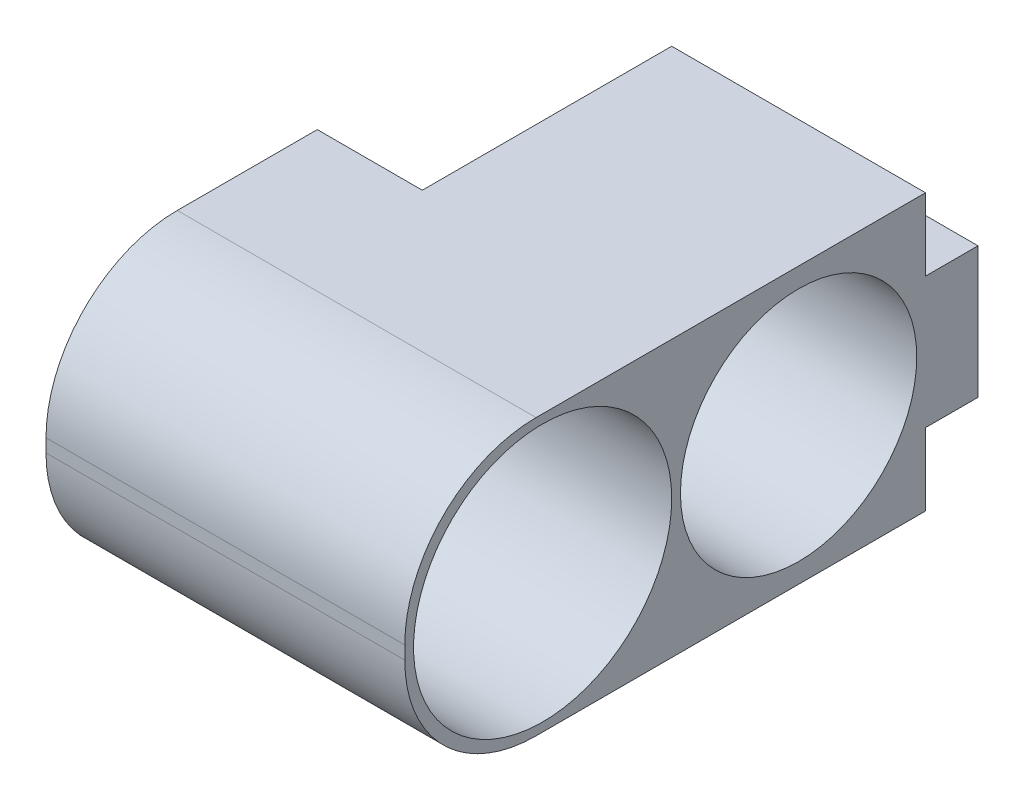
ISO-10303-21;
HEADER;
FILE_DESCRIPTION(('STEP AP214'),'2;1');
FILE_NAME('part.step','',(''),(''),'','','');
FILE_SCHEMA(('AUTOMOTIVE_DESIGN { 1 0 10303 214 1 1 1 1 }'));
ENDSEC;
DATA;
#1=APPLICATION_CONTEXT('core data for automotive mechanical design processes');
#2=APPLICATION_PROTOCOL_DEFINITION('international standard','automotive_design',2000,#1);
#3=PRODUCT_CONTEXT('',#1,'mechanical');
#4=PRODUCT('Part','Part','',(#3));
#5=PRODUCT_RELATED_PRODUCT_CATEGORY('part','',(#4));
#6=PRODUCT_DEFINITION_FORMATION('','',#4);
#7=PRODUCT_DEFINITION_CONTEXT('part definition',#1,'design');
#8=PRODUCT_DEFINITION('design','',#6,#7);
#9=PRODUCT_DEFINITION_SHAPE('','',#8);
#10=(LENGTH_UNIT() NAMED_UNIT(*) SI_UNIT(.MILLI.,.METRE.));
#11=(NAMED_UNIT(*) PLANE_ANGLE_UNIT() SI_UNIT($,.RADIAN.));
#12=(NAMED_UNIT(*) SI_UNIT($,.STERADIAN.) SOLID_ANGLE_UNIT());
#13=UNCERTAINTY_MEASURE_WITH_UNIT(LENGTH_MEASURE(1.E-05),#10,'distance_accuracy_value','');
#14=(GEOMETRIC_REPRESENTATION_CONTEXT(3) GLOBAL_UNCERTAINTY_ASSIGNED_CONTEXT((#13)) GLOBAL_UNIT_ASSIGNED_CONTEXT((#10,
#11,#12)) REPRESENTATION_CONTEXT('',''));
#15=CARTESIAN_POINT('',(0.,0.,0.));
#16=DIRECTION('',(0.,0.,1.));
#17=DIRECTION('',(1.,0.,0.));
#18=AXIS2_PLACEMENT_3D('',#15,#16,#17);
#19=CARTESIAN_POINT('',(-3.00000000000002,0.,8.88178419700125E-13));
#20=DIRECTION('',(1.,0.,0.));
#21=DIRECTION('',(0.,0.,-1.));
#22=AXIS2_PLACEMENT_3D('',#19,#20,#21);
#23=PLANE('',#22);
#24=DIRECTION('',(0.,-0.999999999999999,0.));
#25=VECTOR('',#24,1.);
#26=CARTESIAN_POINT('',(-2.99999999999999,3.15000000000002,0.));
#27=LINE('',#26,#25);
#28=CARTESIAN_POINT('',(-3.00000000000003,1.50000000000004,1.33226762955019E-12));
#29=VERTEX_POINT('',#28);
#30=CARTESIAN_POINT('',(-3.00000000000002,-1.49999999999999,8.88178419700125E-13));
#31=VERTEX_POINT('',#30);
#32=EDGE_CURVE('E175',#29,#31,#27,.T.);
#33=ORIENTED_EDGE('',*,*,#32,.F.);
#34=DIRECTION('',(0.,0.,-1.));
#35=VECTOR('',#34,1.);
#36=CARTESIAN_POINT('',(-3.00000000000003,1.50000000000004,1.33226762955019E-12));
#37=LINE('',#36,#35);
#38=CARTESIAN_POINT('',(-3.00000000000002,1.50000000000004,-1.19999999999987));
#39=VERTEX_POINT('',#38);
#40=EDGE_CURVE('E191',#29,#39,#37,.T.);
#41=ORIENTED_EDGE('',*,*,#40,.T.);
#42=DIRECTION('',(0.,0.999999999999999,0.));
#43=VECTOR('',#42,1.);
#44=CARTESIAN_POINT('',(-3.00000000000002,-1.49999999999995,-1.19999999999987));
#45=LINE('',#44,#43);
#46=CARTESIAN_POINT('',(-3.00000000000002,-1.49999999999995,-1.19999999999987));
#47=VERTEX_POINT('',#46);
#48=EDGE_CURVE('E197',#47,#39,#45,.T.);
#49=ORIENTED_EDGE('',*,*,#48,.F.);
#50=DIRECTION('',(0.,0.,-1.));
#51=VECTOR('',#50,1.);
#52=CARTESIAN_POINT('',(-3.00000000000002,-1.49999999999999,8.88178419700125E-13));
#53=LINE('',#52,#51);
#54=EDGE_CURVE('E198',#31,#47,#53,.T.);
#55=ORIENTED_EDGE('',*,*,#54,.F.);
#56=EDGE_LOOP('',(#33,#41,#49,#55));
#57=FACE_BOUND('',#56,.T.);
#58=ADVANCED_FACE('F43',(#57),#23,.F.);
#59=CARTESIAN_POINT('',(-3.00000000000002,-3.14999999999999,11.9000000000011));
#60=DIRECTION('',(0.,0.,-1.));
#61=DIRECTION('',(0.,0.999999999999999,0.));
#62=AXIS2_PLACEMENT_3D('',#59,#60,#61);
#63=PLANE('',#62);
#64=DIRECTION('',(0.,0.999999999999999,0.));
#65=VECTOR('',#64,1.);
#66=CARTESIAN_POINT('',(0.,-3.14999999999999,11.9));
#67=LINE('',#66,#65);
#68=CARTESIAN_POINT('',(0.,-0.14999999999997,11.9000000000005));
#69=VERTEX_POINT('',#68);
#70=CARTESIAN_POINT('',(0.,0.150000000000025,11.9000000000009));
#71=VERTEX_POINT('',#70);
#72=EDGE_CURVE('E184',#69,#71,#67,.T.);
#73=ORIENTED_EDGE('',*,*,#72,.T.);
#74=DIRECTION('',(1.,0.,0.));
#75=VECTOR('',#74,1.);
#76=CARTESIAN_POINT('',(-3.00000000000001,0.150000000000018,11.9000000000005));
#77=LINE('',#76,#75);
#78=CARTESIAN_POINT('',(-8.20000000000001,0.150000000000018,11.9000000000009));
#79=VERTEX_POINT('',#78);
#80=EDGE_CURVE('E61',#71,#79,#77,.F.);
#81=ORIENTED_EDGE('',*,*,#80,.T.);
#82=DIRECTION('',(0.,0.999999999999999,0.));
#83=VECTOR('',#82,1.);
#84=CARTESIAN_POINT('',(-8.20000000000001,3.15000000000005,11.8999999999996));
#85=LINE('',#84,#83);
#86=CARTESIAN_POINT('',(-8.20000000000002,-0.149999999999977,11.9));
#87=VERTEX_POINT('',#86);
#88=EDGE_CURVE('E160',#87,#79,#85,.T.);
#89=ORIENTED_EDGE('',*,*,#88,.F.);
#90=DIRECTION('',(1.,0.,0.));
#91=VECTOR('',#90,1.);
#92=CARTESIAN_POINT('',(0.,-0.14999999999997,11.9000000000005));
#93=LINE('',#92,#91);
#94=EDGE_CURVE('E224',#87,#69,#93,.T.);
#95=ORIENTED_EDGE('',*,*,#94,.T.);
#96=EDGE_LOOP('',(#73,#81,#89,#95));
#97=FACE_BOUND('',#96,.T.);
#98=ADVANCED_FACE('F233',(#97),#63,.F.);
#99=CARTESIAN_POINT('',(-3.00000000000003,3.15000000000001,11.9000000000009));
#100=DIRECTION('',(0.,-0.999999999999999,0.));
#101=DIRECTION('',(0.,0.,-1.));
#102=AXIS2_PLACEMENT_3D('',#99,#100,#101);
#103=PLANE('',#102);
#104=DIRECTION('',(0.,0.,-1.));
#105=VECTOR('',#104,1.);
#106=CARTESIAN_POINT('',(-8.20000000000001,3.15000000000005,11.8999999999996));
#107=LINE('',#106,#105);
#108=CARTESIAN_POINT('',(-8.20000000000002,3.15000000000003,8.90000000000013));
#109=VERTEX_POINT('',#108);
#110=CARTESIAN_POINT('',(-8.20000000000002,3.15000000000002,5.70000000000004));
#111=VERTEX_POINT('',#110);
#112=EDGE_CURVE('E134',#109,#111,#107,.T.);
#113=ORIENTED_EDGE('',*,*,#112,.F.);
#114=DIRECTION('',(1.,0.,0.));
#115=VECTOR('',#114,1.);
#116=CARTESIAN_POINT('',(-3.00000000000001,3.15000000000001,8.89999999999969));
#117=LINE('',#116,#115);
#118=CARTESIAN_POINT('',(0.,3.15000000000002,8.90000000000102));
#119=VERTEX_POINT('',#118);
#120=EDGE_CURVE('E172',#109,#119,#117,.T.);
#121=ORIENTED_EDGE('',*,*,#120,.T.);
#122=DIRECTION('',(0.,0.,-1.));
#123=VECTOR('',#122,1.);
#124=CARTESIAN_POINT('',(0.,3.15000000000004,11.9000000000005));
#125=LINE('',#124,#123);
#126=CARTESIAN_POINT('',(0.,3.15000000000003,-4.44089209850063E-13));
#127=VERTEX_POINT('',#126);
#128=EDGE_CURVE('E182',#119,#127,#125,.T.);
#129=ORIENTED_EDGE('',*,*,#128,.T.);
#130=DIRECTION('',(1.,0.,0.));
#131=VECTOR('',#130,1.);
#132=CARTESIAN_POINT('',(-2.99999999999999,3.15000000000002,0.));
#133=LINE('',#132,#131);
#134=CARTESIAN_POINT('',(-5.80000000000001,3.15000000000003,4.44089209850063E-13));
#135=VERTEX_POINT('',#134);
#136=EDGE_CURVE('E189',#135,#127,#133,.T.);
#137=ORIENTED_EDGE('',*,*,#136,.F.);
#138=DIRECTION('',(0.,0.,-1.));
#139=VECTOR('',#138,1.);
#140=CARTESIAN_POINT('',(-5.80000000000001,3.15000000000003,4.44089209850063E-13));
#141=LINE('',#140,#139);
#142=CARTESIAN_POINT('',(-5.80000000000002,3.15000000000001,5.70000000000004));
#143=VERTEX_POINT('',#142);
#144=EDGE_CURVE('E156',#143,#135,#141,.T.);
#145=ORIENTED_EDGE('',*,*,#144,.F.);
#146=DIRECTION('',(1.,0.,0.));
#147=VECTOR('',#146,1.);
#148=CARTESIAN_POINT('',(-8.20000000000002,3.15000000000002,5.70000000000004));
#149=LINE('',#148,#147);
#150=EDGE_CURVE('E150',#111,#143,#149,.T.);
#151=ORIENTED_EDGE('',*,*,#150,.F.);
#152=EDGE_LOOP('',(#113,#121,#129,#137,#145,#151));
#153=FACE_BOUND('',#152,.T.);
#154=ADVANCED_FACE('F151',(#153),#103,.F.);
#155=CARTESIAN_POINT('',(-3.00000000000002,-3.14999999999999,11.9000000000011));
#156=DIRECTION('',(0.,-0.999999999999999,0.));
#157=DIRECTION('',(0.,0.,-1.));
#158=AXIS2_PLACEMENT_3D('',#155,#156,#157);
#159=PLANE('',#158);
#160=DIRECTION('',(0.,0.,-1.));
#161=VECTOR('',#160,1.);
#162=CARTESIAN_POINT('',(0.,-3.14999999999999,11.9));
#163=LINE('',#162,#161);
#164=CARTESIAN_POINT('',(0.,-3.14999999999997,8.90000000000124));
#165=VERTEX_POINT('',#164);
#166=CARTESIAN_POINT('',(0.,-3.14999999999997,0.));
#167=VERTEX_POINT('',#166);
#168=EDGE_CURVE('E176',#165,#167,#163,.T.);
#169=ORIENTED_EDGE('',*,*,#168,.F.);
#170=DIRECTION('',(1.,0.,0.));
#171=VECTOR('',#170,1.);
#172=CARTESIAN_POINT('',(-8.20000000000002,-3.14999999999996,8.90000000000057));
#173=LINE('',#172,#171);
#174=CARTESIAN_POINT('',(-8.20000000000002,-3.14999999999996,8.90000000000057));
#175=VERTEX_POINT('',#174);
#176=EDGE_CURVE('E11',#165,#175,#173,.F.);
#177=ORIENTED_EDGE('',*,*,#176,.T.);
#178=DIRECTION('',(0.,0.,1.));
#179=VECTOR('',#178,1.);
#180=CARTESIAN_POINT('',(-8.20000000000002,-3.14999999999997,11.9));
#181=LINE('',#180,#179);
#182=CARTESIAN_POINT('',(-8.20000000000001,-3.14999999999997,5.70000000000048));
#183=VERTEX_POINT('',#182);
#184=EDGE_CURVE('E152',#183,#175,#181,.T.);
#185=ORIENTED_EDGE('',*,*,#184,.F.);
#186=DIRECTION('',(1.,0.,0.));
#187=VECTOR('',#186,1.);
#188=CARTESIAN_POINT('',(-8.20000000000001,-3.14999999999997,5.70000000000048));
#189=LINE('',#188,#187);
#190=CARTESIAN_POINT('',(-5.80000000000001,-3.14999999999996,5.70000000000004));
#191=VERTEX_POINT('',#190);
#192=EDGE_CURVE('E148',#183,#191,#189,.T.);
#193=ORIENTED_EDGE('',*,*,#192,.T.);
#194=DIRECTION('',(0.,0.,1.));
#195=VECTOR('',#194,1.);
#196=CARTESIAN_POINT('',(-5.80000000000001,-3.14999999999997,0.));
#197=LINE('',#196,#195);
#198=CARTESIAN_POINT('',(-5.80000000000001,-3.14999999999997,0.));
#199=VERTEX_POINT('',#198);
#200=EDGE_CURVE('E168',#199,#191,#197,.T.);
#201=ORIENTED_EDGE('',*,*,#200,.F.);
#202=DIRECTION('',(1.,0.,0.));
#203=VECTOR('',#202,1.);
#204=CARTESIAN_POINT('',(-3.00000000000001,-3.14999999999999,0.));
#205=LINE('',#204,#203);
#206=EDGE_CURVE('E190',#199,#167,#205,.T.);
#207=ORIENTED_EDGE('',*,*,#206,.T.);
#208=EDGE_LOOP('',(#169,#177,#185,#193,#201,#207));
#209=FACE_BOUND('',#208,.T.);
#210=ADVANCED_FACE('F236',(#209),#159,.T.);
#211=CARTESIAN_POINT('',(0.,0.,0.));
#212=DIRECTION('',(1.,0.,0.));
#213=DIRECTION('',(0.,0.,-1.));
#214=AXIS2_PLACEMENT_3D('',#211,#212,#213);
#215=PLANE('',#214);
#216=CARTESIAN_POINT('',(0.,0.,2.90000000000123));
#217=DIRECTION('',(1.,0.,0.));
#218=DIRECTION('',(0.,0.,-1.));
#219=AXIS2_PLACEMENT_3D('',#216,#217,#218);
#220=CIRCLE('',#219,2.7);
#221=CARTESIAN_POINT('',(0.,0.,0.200000000000125));
#222=VERTEX_POINT('',#221);
#223=EDGE_CURVE('E220',#222,#222,#220,.T.);
#224=ORIENTED_EDGE('',*,*,#223,.F.);
#225=EDGE_LOOP('',(#224));
#226=FACE_BOUND('',#225,.T.);
#227=CARTESIAN_POINT('',(0.,0.,8.75000000000004));
#228=DIRECTION('',(1.,0.,0.));
#229=DIRECTION('',(0.,0.,-1.));
#230=AXIS2_PLACEMENT_3D('',#227,#228,#229);
#231=CIRCLE('',#230,2.95);
#232=CARTESIAN_POINT('',(0.,0.,5.80000000000048));
#233=VERTEX_POINT('',#232);
#234=EDGE_CURVE('E307',#233,#233,#231,.T.);
#235=ORIENTED_EDGE('',*,*,#234,.F.);
#236=EDGE_LOOP('',(#235));
#237=FACE_BOUND('',#236,.T.);
#238=ORIENTED_EDGE('',*,*,#128,.F.);
#239=CARTESIAN_POINT('',(0.,0.150000000000018,8.90000000000035));
#240=DIRECTION('',(1.,0.,0.));
#241=DIRECTION('',(0.,0.,-1.));
#242=AXIS2_PLACEMENT_3D('',#239,#240,#241);
#243=CIRCLE('',#242,3.);
#244=EDGE_CURVE('E221',#119,#71,#243,.T.);
#245=ORIENTED_EDGE('',*,*,#244,.T.);
#246=ORIENTED_EDGE('',*,*,#72,.F.);
#247=CARTESIAN_POINT('',(0.,-0.149999999999977,8.90000000000035));
#248=DIRECTION('',(1.,0.,0.));
#249=DIRECTION('',(0.,0.,-1.));
#250=AXIS2_PLACEMENT_3D('',#247,#248,#249);
#251=CIRCLE('',#250,3.);
#252=EDGE_CURVE('E216',#69,#165,#251,.T.);
#253=ORIENTED_EDGE('',*,*,#252,.T.);
#254=ORIENTED_EDGE('',*,*,#168,.T.);
#255=DIRECTION('',(0.,0.999999999999999,0.));
#256=VECTOR('',#255,1.);
#257=CARTESIAN_POINT('',(0.,-3.14999999999997,0.));
#258=LINE('',#257,#256);
#259=CARTESIAN_POINT('',(0.,-1.49999999999997,4.44089209850063E-13));
#260=VERTEX_POINT('',#259);
#261=EDGE_CURVE('E179',#167,#260,#258,.T.);
#262=ORIENTED_EDGE('',*,*,#261,.T.);
#263=DIRECTION('',(0.,0.,-1.));
#264=VECTOR('',#263,1.);
#265=CARTESIAN_POINT('',(0.,-1.49999999999997,4.44089209850063E-13));
#266=LINE('',#265,#264);
#267=CARTESIAN_POINT('',(0.,-1.49999999999999,-1.20000000000009));
#268=VERTEX_POINT('',#267);
#269=EDGE_CURVE('E200',#260,#268,#266,.T.);
#270=ORIENTED_EDGE('',*,*,#269,.T.);
#271=DIRECTION('',(0.,0.999999999999999,0.));
#272=VECTOR('',#271,1.);
#273=CARTESIAN_POINT('',(0.,-1.49999999999999,-1.20000000000009));
#274=LINE('',#273,#272);
#275=CARTESIAN_POINT('',(0.,1.50000000000003,-1.19999999999942));
#276=VERTEX_POINT('',#275);
#277=EDGE_CURVE('E207',#268,#276,#274,.T.);
#278=ORIENTED_EDGE('',*,*,#277,.T.);
#279=DIRECTION('',(0.,0.,-1.));
#280=VECTOR('',#279,1.);
#281=CARTESIAN_POINT('',(0.,1.50000000000004,8.88178419700125E-13));
#282=LINE('',#281,#280);
#283=CARTESIAN_POINT('',(0.,1.50000000000004,8.88178419700125E-13));
#284=VERTEX_POINT('',#283);
#285=EDGE_CURVE('E171',#284,#276,#282,.T.);
#286=ORIENTED_EDGE('',*,*,#285,.F.);
#287=EDGE_CURVE('E178',#284,#127,#258,.T.);
#288=ORIENTED_EDGE('',*,*,#287,.T.);
#289=EDGE_LOOP('',(#238,#245,#246,#253,#254,#262,#270,#278,#286,#288));
#290=FACE_BOUND('',#289,.T.);
#291=ADVANCED_FACE('F232',(#226,#237,#290),#215,.T.);
#292=CARTESIAN_POINT('',(-3.00000000000001,-3.14999999999999,0.));
#293=DIRECTION('',(0.,0.,-1.));
#294=DIRECTION('',(0.,0.999999999999999,0.));
#295=AXIS2_PLACEMENT_3D('',#292,#293,#294);
#296=PLANE('',#295);
#297=DIRECTION('',(1.,0.,0.));
#298=VECTOR('',#297,1.);
#299=CARTESIAN_POINT('',(-3.00000000000003,1.50000000000004,1.33226762955019E-12));
#300=LINE('',#299,#298);
#301=EDGE_CURVE('E174',#29,#284,#300,.T.);
#302=ORIENTED_EDGE('',*,*,#301,.F.);
#303=ORIENTED_EDGE('',*,*,#32,.T.);
#304=DIRECTION('',(1.,0.,0.));
#305=VECTOR('',#304,1.);
#306=CARTESIAN_POINT('',(-3.00000000000002,-1.49999999999999,8.88178419700125E-13));
#307=LINE('',#306,#305);
#308=EDGE_CURVE('E192',#31,#260,#307,.T.);
#309=ORIENTED_EDGE('',*,*,#308,.T.);
#310=ORIENTED_EDGE('',*,*,#261,.F.);
#311=ORIENTED_EDGE('',*,*,#206,.F.);
#312=DIRECTION('',(0.,-0.999999999999999,0.));
#313=VECTOR('',#312,1.);
#314=CARTESIAN_POINT('',(-5.80000000000001,3.15000000000003,4.44089209850063E-13));
#315=LINE('',#314,#313);
#316=EDGE_CURVE('E159',#135,#199,#315,.T.);
#317=ORIENTED_EDGE('',*,*,#316,.F.);
#318=ORIENTED_EDGE('',*,*,#136,.T.);
#319=ORIENTED_EDGE('',*,*,#287,.F.);
#320=EDGE_LOOP('',(#302,#303,#309,#310,#311,#317,#318,#319));
#321=FACE_BOUND('',#320,.T.);
#322=ADVANCED_FACE('F245',(#321),#296,.T.);
#323=CARTESIAN_POINT('',(-3.00000000000002,-1.49999999999995,-1.19999999999987));
#324=DIRECTION('',(0.,0.,-1.));
#325=DIRECTION('',(-1.,0.,0.));
#326=AXIS2_PLACEMENT_3D('',#323,#324,#325);
#327=PLANE('',#326);
#328=ORIENTED_EDGE('',*,*,#277,.F.);
#329=DIRECTION('',(1.,0.,0.));
#330=VECTOR('',#329,1.);
#331=CARTESIAN_POINT('',(-3.00000000000002,-1.49999999999995,-1.19999999999987));
#332=LINE('',#331,#330);
#333=EDGE_CURVE('E204',#47,#268,#332,.T.);
#334=ORIENTED_EDGE('',*,*,#333,.F.);
#335=ORIENTED_EDGE('',*,*,#48,.T.);
#336=DIRECTION('',(1.,0.,0.));
#337=VECTOR('',#336,1.);
#338=CARTESIAN_POINT('',(-3.00000000000002,1.50000000000004,-1.19999999999987));
#339=LINE('',#338,#337);
#340=EDGE_CURVE('E177',#39,#276,#339,.T.);
#341=ORIENTED_EDGE('',*,*,#340,.T.);
#342=EDGE_LOOP('',(#328,#334,#335,#341));
#343=FACE_BOUND('',#342,.T.);
#344=ADVANCED_FACE('F255',(#343),#327,.T.);
#345=CARTESIAN_POINT('',(-3.00000000000002,-1.49999999999999,8.88178419700125E-13));
#346=DIRECTION('',(0.,-0.999999999999999,0.));
#347=DIRECTION('',(0.,0.,-1.));
#348=AXIS2_PLACEMENT_3D('',#345,#346,#347);
#349=PLANE('',#348);
#350=ORIENTED_EDGE('',*,*,#269,.F.);
#351=ORIENTED_EDGE('',*,*,#308,.F.);
#352=ORIENTED_EDGE('',*,*,#54,.T.);
#353=ORIENTED_EDGE('',*,*,#333,.T.);
#354=EDGE_LOOP('',(#350,#351,#352,#353));
#355=FACE_BOUND('',#354,.T.);
#356=ADVANCED_FACE('F247',(#355),#349,.T.);
#357=CARTESIAN_POINT('',(-3.00000000000003,1.50000000000004,1.33226762955019E-12));
#358=DIRECTION('',(0.,-0.999999999999999,0.));
#359=DIRECTION('',(0.,0.,-1.));
#360=AXIS2_PLACEMENT_3D('',#357,#358,#359);
#361=PLANE('',#360);
#362=ORIENTED_EDGE('',*,*,#285,.T.);
#363=ORIENTED_EDGE('',*,*,#340,.F.);
#364=ORIENTED_EDGE('',*,*,#40,.F.);
#365=ORIENTED_EDGE('',*,*,#301,.T.);
#366=EDGE_LOOP('',(#362,#363,#364,#365));
#367=FACE_BOUND('',#366,.T.);
#368=ADVANCED_FACE('F257',(#367),#361,.F.);
#369=CARTESIAN_POINT('',(-5.80000000000001,0.,4.44089209850063E-13));
#370=DIRECTION('',(1.,0.,0.));
#371=DIRECTION('',(0.,0.,-1.));
#372=AXIS2_PLACEMENT_3D('',#369,#370,#371);
#373=PLANE('',#372);
#374=CARTESIAN_POINT('',(-5.80000000000003,0.,2.90000000000035));
#375=DIRECTION('',(1.,0.,0.));
#376=DIRECTION('',(0.,0.,-1.));
#377=AXIS2_PLACEMENT_3D('',#374,#375,#376);
#378=CIRCLE('',#377,2.7);
#379=CARTESIAN_POINT('',(-5.80000000000003,0.,0.200000000000125));
#380=VERTEX_POINT('',#379);
#381=EDGE_CURVE('E141',#380,#380,#378,.T.);
#382=ORIENTED_EDGE('',*,*,#381,.T.);
#383=EDGE_LOOP('',(#382));
#384=FACE_BOUND('',#383,.T.);
#385=ORIENTED_EDGE('',*,*,#144,.T.);
#386=ORIENTED_EDGE('',*,*,#316,.T.);
#387=ORIENTED_EDGE('',*,*,#200,.T.);
#388=DIRECTION('',(0.,0.999999999999999,0.));
#389=VECTOR('',#388,1.);
#390=CARTESIAN_POINT('',(-5.80000000000002,3.15000000000001,5.70000000000004));
#391=LINE('',#390,#389);
#392=EDGE_CURVE('E169',#191,#143,#391,.T.);
#393=ORIENTED_EDGE('',*,*,#392,.T.);
#394=EDGE_LOOP('',(#385,#386,#387,#393));
#395=FACE_BOUND('',#394,.T.);
#396=ADVANCED_FACE('F278',(#384,#395),#373,.F.);
#397=CARTESIAN_POINT('',(-8.20000000000002,3.15000000000002,5.70000000000004));
#398=DIRECTION('',(0.,0.,1.));
#399=DIRECTION('',(1.,0.,0.));
#400=AXIS2_PLACEMENT_3D('',#397,#398,#399);
#401=PLANE('',#400);
#402=ORIENTED_EDGE('',*,*,#150,.T.);
#403=ORIENTED_EDGE('',*,*,#392,.F.);
#404=ORIENTED_EDGE('',*,*,#192,.F.);
#405=DIRECTION('',(0.,-0.999999999999999,0.));
#406=VECTOR('',#405,1.);
#407=CARTESIAN_POINT('',(-8.20000000000002,3.15000000000002,5.70000000000004));
#408=LINE('',#407,#406);
#409=EDGE_CURVE('E136',#111,#183,#408,.T.);
#410=ORIENTED_EDGE('',*,*,#409,.F.);
#411=EDGE_LOOP('',(#402,#403,#404,#410));
#412=FACE_BOUND('',#411,.T.);
#413=ADVANCED_FACE('F147',(#412),#401,.F.);
#414=CARTESIAN_POINT('',(-8.20000000000001,0.,1.33226762955019E-12));
#415=DIRECTION('',(-1.,0.,0.));
#416=DIRECTION('',(0.,0.,1.));
#417=AXIS2_PLACEMENT_3D('',#414,#415,#416);
#418=PLANE('',#417);
#419=CARTESIAN_POINT('',(-8.20000000000001,0.,8.75000000000048));
#420=DIRECTION('',(1.,0.,0.));
#421=DIRECTION('',(0.,0.,-1.));
#422=AXIS2_PLACEMENT_3D('',#419,#420,#421);
#423=CIRCLE('',#422,2.95);
#424=CARTESIAN_POINT('',(-8.2,0.,5.80000000000048));
#425=VERTEX_POINT('',#424);
#426=EDGE_CURVE('E306',#425,#425,#423,.T.);
#427=ORIENTED_EDGE('',*,*,#426,.T.);
#428=EDGE_LOOP('',(#427));
#429=FACE_BOUND('',#428,.T.);
#430=ORIENTED_EDGE('',*,*,#88,.T.);
#431=CARTESIAN_POINT('',(-8.20000000000002,0.150000000000004,8.90000000000013));
#432=DIRECTION('',(-1.,0.,0.));
#433=DIRECTION('',(0.,0.,1.));
#434=AXIS2_PLACEMENT_3D('',#431,#432,#433);
#435=CIRCLE('',#434,3.);
#436=EDGE_CURVE('E51',#79,#109,#435,.T.);
#437=ORIENTED_EDGE('',*,*,#436,.T.);
#438=ORIENTED_EDGE('',*,*,#112,.T.);
#439=ORIENTED_EDGE('',*,*,#409,.T.);
#440=ORIENTED_EDGE('',*,*,#184,.T.);
#441=CARTESIAN_POINT('',(-8.20000000000001,-0.14999999999997,8.90000000000013));
#442=DIRECTION('',(-1.,0.,0.));
#443=DIRECTION('',(0.,0.,1.));
#444=AXIS2_PLACEMENT_3D('',#441,#442,#443);
#445=CIRCLE('',#444,3.);
#446=EDGE_CURVE('E227',#175,#87,#445,.T.);
#447=ORIENTED_EDGE('',*,*,#446,.T.);
#448=EDGE_LOOP('',(#430,#437,#438,#439,#440,#447));
#449=FACE_BOUND('',#448,.T.);
#450=ADVANCED_FACE('F133',(#429,#449),#418,.T.);
#451=CARTESIAN_POINT('',(-8.20000000000001,0.,8.75000000000048));
#452=DIRECTION('',(1.,0.,0.));
#453=DIRECTION('',(0.,0.,-1.));
#454=AXIS2_PLACEMENT_3D('',#451,#452,#453);
#455=CYLINDRICAL_SURFACE('',#454,2.95);
#456=CARTESIAN_POINT('',(-8.2,0.,5.80000000000048));
#457=CARTESIAN_POINT('',(-8.11458333333334,0.,5.80000000000048));
#458=CARTESIAN_POINT('',(-8.02916666666667,0.,5.80000000000048));
#459=CARTESIAN_POINT('',(-7.85833333333334,0.,5.80000000000048));
#460=CARTESIAN_POINT('',(-7.77291666666667,0.,5.80000000000048));
#461=CARTESIAN_POINT('',(-7.60208333333334,0.,5.80000000000048));
#462=CARTESIAN_POINT('',(-7.51666666666667,0.,5.80000000000048));
#463=CARTESIAN_POINT('',(-7.34583333333334,0.,5.80000000000048));
#464=CARTESIAN_POINT('',(-7.26041666666667,0.,5.80000000000048));
#465=CARTESIAN_POINT('',(-7.08958333333334,0.,5.80000000000048));
#466=CARTESIAN_POINT('',(-7.00416666666668,0.,5.80000000000048));
#467=CARTESIAN_POINT('',(-6.83333333333334,0.,5.80000000000048));
#468=CARTESIAN_POINT('',(-6.74791666666668,0.,5.80000000000048));
#469=CARTESIAN_POINT('',(-6.57708333333334,0.,5.80000000000048));
#470=CARTESIAN_POINT('',(-6.49166666666668,0.,5.80000000000048));
#471=CARTESIAN_POINT('',(-6.32083333333334,0.,5.80000000000048));
#472=CARTESIAN_POINT('',(-6.23541666666668,0.,5.80000000000048));
#473=CARTESIAN_POINT('',(-6.06458333333334,0.,5.80000000000048));
#474=CARTESIAN_POINT('',(-5.97916666666668,0.,5.80000000000048));
#475=CARTESIAN_POINT('',(-5.80833333333335,0.,5.80000000000048));
#476=CARTESIAN_POINT('',(-5.72291666666668,0.,5.80000000000048));
#477=CARTESIAN_POINT('',(-5.55208333333335,0.,5.80000000000048));
#478=CARTESIAN_POINT('',(-5.46666666666668,0.,5.80000000000048));
#479=CARTESIAN_POINT('',(-5.29583333333335,0.,5.80000000000048));
#480=CARTESIAN_POINT('',(-5.21041666666668,0.,5.80000000000048));
#481=CARTESIAN_POINT('',(-5.03958333333335,0.,5.80000000000048));
#482=CARTESIAN_POINT('',(-4.95416666666668,0.,5.80000000000048));
#483=CARTESIAN_POINT('',(-4.78333333333335,0.,5.80000000000048));
#484=CARTESIAN_POINT('',(-4.69791666666668,0.,5.80000000000048));
#485=CARTESIAN_POINT('',(-4.52708333333335,0.,5.80000000000048));
#486=CARTESIAN_POINT('',(-4.44166666666668,0.,5.80000000000048));
#487=CARTESIAN_POINT('',(-4.27083333333335,0.,5.80000000000048));
#488=CARTESIAN_POINT('',(-4.18541666666668,0.,5.80000000000048));
#489=CARTESIAN_POINT('',(-4.01458333333335,0.,5.80000000000048));
#490=CARTESIAN_POINT('',(-3.92916666666668,0.,5.80000000000048));
#491=CARTESIAN_POINT('',(-3.75833333333335,0.,5.80000000000048));
#492=CARTESIAN_POINT('',(-3.67291666666668,0.,5.80000000000048));
#493=CARTESIAN_POINT('',(-3.50208333333335,0.,5.80000000000048));
#494=CARTESIAN_POINT('',(-3.41666666666669,0.,5.80000000000048));
#495=CARTESIAN_POINT('',(-3.24583333333335,0.,5.80000000000048));
#496=CARTESIAN_POINT('',(-3.16041666666669,0.,5.80000000000048));
#497=CARTESIAN_POINT('',(-2.98958333333335,0.,5.80000000000048));
#498=CARTESIAN_POINT('',(-2.90416666666669,0.,5.80000000000048));
#499=CARTESIAN_POINT('',(-2.73333333333335,0.,5.80000000000048));
#500=CARTESIAN_POINT('',(-2.64791666666669,0.,5.80000000000048));
#501=CARTESIAN_POINT('',(-2.47708333333335,0.,5.80000000000048));
#502=CARTESIAN_POINT('',(-2.39166666666669,0.,5.80000000000048));
#503=CARTESIAN_POINT('',(-2.22083333333335,0.,5.80000000000048));
#504=CARTESIAN_POINT('',(-2.13541666666669,0.,5.80000000000048));
#505=CARTESIAN_POINT('',(-1.96458333333336,0.,5.80000000000048));
#506=CARTESIAN_POINT('',(-1.87916666666669,0.,5.80000000000048));
#507=CARTESIAN_POINT('',(-1.70833333333336,0.,5.80000000000048));
#508=CARTESIAN_POINT('',(-1.62291666666669,0.,5.80000000000048));
#509=CARTESIAN_POINT('',(-1.45208333333336,0.,5.80000000000048));
#510=CARTESIAN_POINT('',(-1.36666666666669,0.,5.80000000000048));
#511=CARTESIAN_POINT('',(-1.19583333333336,0.,5.80000000000048));
#512=CARTESIAN_POINT('',(-1.11041666666669,0.,5.80000000000048));
#513=CARTESIAN_POINT('',(-0.939583333333359,0.,5.80000000000048));
#514=CARTESIAN_POINT('',(-0.854166666666692,0.,5.80000000000048));
#515=CARTESIAN_POINT('',(-0.683333333333359,0.,5.80000000000048));
#516=CARTESIAN_POINT('',(-0.597916666666693,0.,5.80000000000048));
#517=CARTESIAN_POINT('',(-0.42708333333336,0.,5.80000000000048));
#518=CARTESIAN_POINT('',(-0.341666666666694,0.,5.80000000000048));
#519=CARTESIAN_POINT('',(-0.170833333333361,0.,5.80000000000048));
#520=CARTESIAN_POINT('',(-0.0854166666666944,0.,5.80000000000048));
#521=CARTESIAN_POINT('',(0.,0.,5.80000000000048));
#522=B_SPLINE_CURVE_WITH_KNOTS('',3,(#456,#457,#458,#459,#460,#461,#462,#463,#464,#465,#466,
#467,#468,#469,#470,#471,#472,#473,#474,#475,#476,#477,#478,#479,#480,#481,#482,#483,#484,#485,
#486,#487,#488,#489,#490,#491,#492,#493,#494,#495,#496,#497,#498,#499,#500,#501,#502,#503,#504,
#505,#506,#507,#508,#509,#510,#511,#512,#513,#514,#515,#516,#517,#518,#519,#520,#521),
.UNSPECIFIED.,.F.,.F.,(4,2,2,2,2,2,2,2,2,2,2,2,2,2,2,2,2,2,2,2,2,2,2,2,2,2,2,2,2,2,2,2,4),(0.,
0.256249999999998,0.512499999999997,0.768749999999997,1.025,1.28125,1.5375,1.79374999999999,
2.04999999999999,2.30624999999999,2.56249999999999,2.81874999999999,3.07499999999999,
3.33124999999999,3.58749999999999,3.84374999999999,4.09999999999999,4.35624999999999,
4.61249999999999,4.86874999999999,5.12499999999998,5.38124999999998,5.63749999999998,
5.89374999999998,6.14999999999998,6.40624999999998,6.66249999999998,6.91874999999998,
7.17499999999998,7.43124999999998,7.68749999999998,7.94374999999998,8.19999999999998),.UNSPECIFIED.);
#523=EDGE_CURVE('BSEAM267',#425,#233,#522,.T.);
#524=ORIENTED_EDGE('',*,*,#426,.F.);
#525=ORIENTED_EDGE('',*,*,#234,.T.);
#526=ORIENTED_EDGE('',*,*,#523,.T.);
#527=ORIENTED_EDGE('',*,*,#523,.F.);
#528=EDGE_LOOP('',(#524,#526,#525,#527));
#529=FACE_BOUND('',#528,.T.);
#530=ADVANCED_FACE('F267',(#529),#455,.F.);
#531=CARTESIAN_POINT('',(-8.20000000000001,0.,2.90000000000012));
#532=DIRECTION('',(1.,0.,0.));
#533=DIRECTION('',(0.,0.,-1.));
#534=AXIS2_PLACEMENT_3D('',#531,#532,#533);
#535=CYLINDRICAL_SURFACE('',#534,2.7);
#536=CARTESIAN_POINT('',(0.,0.,0.200000000000125));
#537=CARTESIAN_POINT('',(-0.0604166666666808,0.,0.200000000000125));
#538=CARTESIAN_POINT('',(-0.120833333333348,0.,0.200000000000125));
#539=CARTESIAN_POINT('',(-0.241666666666682,0.,0.200000000000125));
#540=CARTESIAN_POINT('',(-0.302083333333349,0.,0.200000000000125));
#541=CARTESIAN_POINT('',(-0.422916666666682,0.,0.200000000000125));
#542=CARTESIAN_POINT('',(-0.483333333333348,0.,0.200000000000125));
#543=CARTESIAN_POINT('',(-0.604166666666681,0.,0.200000000000125));
#544=CARTESIAN_POINT('',(-0.664583333333348,0.,0.200000000000125));
#545=CARTESIAN_POINT('',(-0.785416666666682,0.,0.200000000000125));
#546=CARTESIAN_POINT('',(-0.845833333333349,0.,0.200000000000125));
#547=CARTESIAN_POINT('',(-0.966666666666683,0.,0.200000000000125));
#548=CARTESIAN_POINT('',(-1.02708333333335,0.,0.200000000000125));
#549=CARTESIAN_POINT('',(-1.14791666666668,0.,0.200000000000125));
#550=CARTESIAN_POINT('',(-1.20833333333335,0.,0.200000000000125));
#551=CARTESIAN_POINT('',(-1.32916666666668,0.,0.200000000000125));
#552=CARTESIAN_POINT('',(-1.38958333333335,0.,0.200000000000125));
#553=CARTESIAN_POINT('',(-1.51041666666668,0.,0.200000000000125));
#554=CARTESIAN_POINT('',(-1.57083333333335,0.,0.200000000000125));
#555=CARTESIAN_POINT('',(-1.69166666666668,0.,0.200000000000125));
#556=CARTESIAN_POINT('',(-1.75208333333335,0.,0.200000000000125));
#557=CARTESIAN_POINT('',(-1.87291666666668,0.,0.200000000000125));
#558=CARTESIAN_POINT('',(-1.93333333333335,0.,0.200000000000125));
#559=CARTESIAN_POINT('',(-2.05416666666668,0.,0.200000000000125));
#560=CARTESIAN_POINT('',(-2.11458333333335,0.,0.200000000000125));
#561=CARTESIAN_POINT('',(-2.23541666666669,0.,0.200000000000125));
#562=CARTESIAN_POINT('',(-2.29583333333335,0.,0.200000000000125));
#563=CARTESIAN_POINT('',(-2.41666666666669,0.,0.200000000000125));
#564=CARTESIAN_POINT('',(-2.47708333333335,0.,0.200000000000125));
#565=CARTESIAN_POINT('',(-2.59791666666669,0.,0.200000000000125));
#566=CARTESIAN_POINT('',(-2.65833333333335,0.,0.200000000000125));
#567=CARTESIAN_POINT('',(-2.77916666666669,0.,0.200000000000125));
#568=CARTESIAN_POINT('',(-2.83958333333335,0.,0.200000000000125));
#569=CARTESIAN_POINT('',(-2.96041666666669,0.,0.200000000000125));
#570=CARTESIAN_POINT('',(-3.02083333333335,0.,0.200000000000125));
#571=CARTESIAN_POINT('',(-3.14166666666669,0.,0.200000000000125));
#572=CARTESIAN_POINT('',(-3.20208333333336,0.,0.200000000000125));
#573=CARTESIAN_POINT('',(-3.32291666666669,0.,0.200000000000125));
#574=CARTESIAN_POINT('',(-3.38333333333336,0.,0.200000000000125));
#575=CARTESIAN_POINT('',(-3.50416666666669,0.,0.200000000000125));
#576=CARTESIAN_POINT('',(-3.56458333333336,0.,0.200000000000125));
#577=CARTESIAN_POINT('',(-3.68541666666669,0.,0.200000000000125));
#578=CARTESIAN_POINT('',(-3.74583333333336,0.,0.200000000000125));
#579=CARTESIAN_POINT('',(-3.86666666666669,0.,0.200000000000125));
#580=CARTESIAN_POINT('',(-3.92708333333336,0.,0.200000000000125));
#581=CARTESIAN_POINT('',(-4.04791666666669,0.,0.200000000000125));
#582=CARTESIAN_POINT('',(-4.10833333333336,0.,0.200000000000125));
#583=CARTESIAN_POINT('',(-4.22916666666669,0.,0.200000000000125));
#584=CARTESIAN_POINT('',(-4.28958333333336,0.,0.200000000000125));
#585=CARTESIAN_POINT('',(-4.41041666666669,0.,0.200000000000125));
#586=CARTESIAN_POINT('',(-4.47083333333336,0.,0.200000000000125));
#587=CARTESIAN_POINT('',(-4.59166666666669,0.,0.200000000000125));
#588=CARTESIAN_POINT('',(-4.65208333333336,0.,0.200000000000125));
#589=CARTESIAN_POINT('',(-4.77291666666669,0.,0.200000000000125));
#590=CARTESIAN_POINT('',(-4.83333333333336,0.,0.200000000000125));
#591=CARTESIAN_POINT('',(-4.95416666666669,0.,0.200000000000125));
#592=CARTESIAN_POINT('',(-5.01458333333336,0.,0.200000000000125));
#593=CARTESIAN_POINT('',(-5.13541666666669,0.,0.200000000000125));
#594=CARTESIAN_POINT('',(-5.19583333333336,0.,0.200000000000125));
#595=CARTESIAN_POINT('',(-5.31666666666669,0.,0.200000000000125));
#596=CARTESIAN_POINT('',(-5.37708333333336,0.,0.200000000000125));
#597=CARTESIAN_POINT('',(-5.49791666666669,0.,0.200000000000125));
#598=CARTESIAN_POINT('',(-5.55833333333336,0.,0.200000000000125));
#599=CARTESIAN_POINT('',(-5.67916666666669,0.,0.200000000000125));
#600=CARTESIAN_POINT('',(-5.73958333333336,0.,0.200000000000125));
#601=CARTESIAN_POINT('',(-5.80000000000003,0.,0.200000000000125));
#602=B_SPLINE_CURVE_WITH_KNOTS('',3,(#536,#537,#538,#539,#540,#541,#542,#543,#544,#545,#546,
#547,#548,#549,#550,#551,#552,#553,#554,#555,#556,#557,#558,#559,#560,#561,#562,#563,#564,#565,
#566,#567,#568,#569,#570,#571,#572,#573,#574,#575,#576,#577,#578,#579,#580,#581,#582,#583,#584,
#585,#586,#587,#588,#589,#590,#591,#592,#593,#594,#595,#596,#597,#598,#599,#600,#601),
.UNSPECIFIED.,.F.,.F.,(4,2,2,2,2,2,2,2,2,2,2,2,2,2,2,2,2,2,2,2,2,2,2,2,2,2,2,2,2,2,2,2,4),(0.,
0.181250000000001,0.362500000000002,0.543750000000001,0.725000000000001,0.906250000000002,
1.0875,1.26875,1.45,1.63125,1.8125,1.99375,2.17500000000001,2.35625000000001,2.53750000000001,
2.71875000000001,2.90000000000001,3.08125000000001,3.26250000000001,3.44375000000001,
3.62500000000001,3.80625000000001,3.98750000000001,4.16875000000001,4.35000000000001,
4.53125000000001,4.71250000000001,4.89375000000001,5.07500000000001,5.25625000000001,
5.43750000000001,5.61875000000001,5.80000000000001),.UNSPECIFIED.);
#603=EDGE_CURVE('BSEAM265',#222,#380,#602,.T.);
#604=ORIENTED_EDGE('',*,*,#223,.T.);
#605=ORIENTED_EDGE('',*,*,#381,.F.);
#606=ORIENTED_EDGE('',*,*,#603,.T.);
#607=ORIENTED_EDGE('',*,*,#603,.F.);
#608=EDGE_LOOP('',(#604,#606,#605,#607));
#609=FACE_BOUND('',#608,.T.);
#610=ADVANCED_FACE('F265',(#609),#535,.F.);
#611=CARTESIAN_POINT('',(-3.00000000000001,0.150000000000046,8.90000000000013));
#612=DIRECTION('',(1.,0.,0.));
#613=DIRECTION('',(0.,0.,-1.));
#614=AXIS2_PLACEMENT_3D('',#611,#612,#613);
#615=CYLINDRICAL_SURFACE('',#614,3.);
#616=ORIENTED_EDGE('',*,*,#436,.F.);
#617=ORIENTED_EDGE('',*,*,#80,.F.);
#618=ORIENTED_EDGE('',*,*,#244,.F.);
#619=ORIENTED_EDGE('',*,*,#120,.F.);
#620=EDGE_LOOP('',(#616,#617,#618,#619));
#621=FACE_BOUND('',#620,.T.);
#622=ADVANCED_FACE('F258',(#621),#615,.T.);
#623=CARTESIAN_POINT('',(-3.00000000000001,-0.149999999999963,8.89999999999969));
#624=DIRECTION('',(-1.,0.,0.));
#625=DIRECTION('',(0.,0.,1.));
#626=AXIS2_PLACEMENT_3D('',#623,#624,#625);
#627=CYLINDRICAL_SURFACE('',#626,3.);
#628=ORIENTED_EDGE('',*,*,#446,.F.);
#629=ORIENTED_EDGE('',*,*,#176,.F.);
#630=ORIENTED_EDGE('',*,*,#252,.F.);
#631=ORIENTED_EDGE('',*,*,#94,.F.);
#632=EDGE_LOOP('',(#628,#629,#630,#631));
#633=FACE_BOUND('',#632,.T.);
#634=ADVANCED_FACE('F44',(#633),#627,.T.);
#635=CLOSED_SHELL('',(#58,#98,#154,#210,#291,#322,#344,#356,#368,#396,#413,#450,#530,#610,#622,#634));
#636=MANIFOLD_SOLID_BREP('B2',#635);
#637=ADVANCED_BREP_SHAPE_REPRESENTATION('',(#18,#636),#14);
#638=SHAPE_DEFINITION_REPRESENTATION(#9,#637);
ENDSEC;
END-ISO-10303-21;
